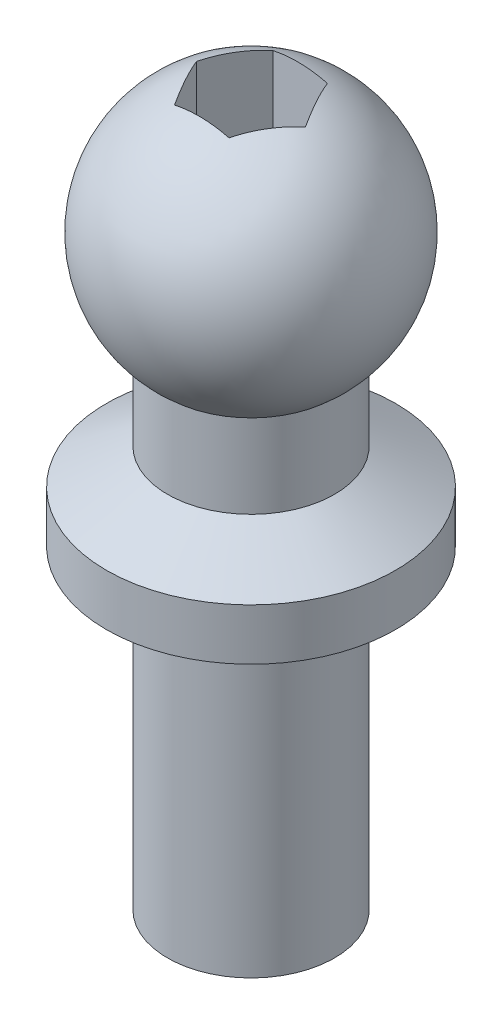
ISO-10303-21;
HEADER;
FILE_DESCRIPTION(('STEP AP214'),'2;1');
FILE_NAME('part.step','',(''),(''),'','','');
FILE_SCHEMA(('AUTOMOTIVE_DESIGN { 1 0 10303 214 1 1 1 1 }'));
ENDSEC;
DATA;
#1=APPLICATION_CONTEXT('core data for automotive mechanical design processes');
#2=APPLICATION_PROTOCOL_DEFINITION('international standard','automotive_design',2000,#1);
#3=PRODUCT_CONTEXT('',#1,'mechanical');
#4=PRODUCT('Part','Part','',(#3));
#5=PRODUCT_RELATED_PRODUCT_CATEGORY('part','',(#4));
#6=PRODUCT_DEFINITION_FORMATION('','',#4);
#7=PRODUCT_DEFINITION_CONTEXT('part definition',#1,'design');
#8=PRODUCT_DEFINITION('design','',#6,#7);
#9=PRODUCT_DEFINITION_SHAPE('','',#8);
#10=(LENGTH_UNIT() NAMED_UNIT(*) SI_UNIT(.MILLI.,.METRE.));
#11=(NAMED_UNIT(*) PLANE_ANGLE_UNIT() SI_UNIT($,.RADIAN.));
#12=(NAMED_UNIT(*) SI_UNIT($,.STERADIAN.) SOLID_ANGLE_UNIT());
#13=UNCERTAINTY_MEASURE_WITH_UNIT(LENGTH_MEASURE(1.E-05),#10,'distance_accuracy_value','');
#14=(GEOMETRIC_REPRESENTATION_CONTEXT(3) GLOBAL_UNCERTAINTY_ASSIGNED_CONTEXT((#13)) GLOBAL_UNIT_ASSIGNED_CONTEXT((#10,
#11,#12)) REPRESENTATION_CONTEXT('',''));
#15=CARTESIAN_POINT('',(0.,0.,0.));
#16=DIRECTION('',(0.,0.,1.));
#17=DIRECTION('',(1.,0.,0.));
#18=AXIS2_PLACEMENT_3D('',#15,#16,#17);
#19=CARTESIAN_POINT('',(0.,9.13356950414487,0.));
#20=DIRECTION('',(0.,-1.,0.));
#21=DIRECTION('',(1.,0.,0.));
#22=AXIS2_PLACEMENT_3D('',#19,#20,#21);
#23=SPHERICAL_SURFACE('',#22,2.05);
#24=CARTESIAN_POINT('',(0.,7.54848275573014,0.));
#25=DIRECTION('',(0.,-1.,0.));
#26=DIRECTION('',(0.,0.,-1.));
#27=AXIS2_PLACEMENT_3D('',#24,#25,#26);
#28=CIRCLE('',#27,1.3);
#29=CARTESIAN_POINT('',(0.,7.54848275573014,-1.3));
#30=VERTEX_POINT('',#29);
#31=EDGE_CURVE('E105',#30,#30,#28,.T.);
#32=ORIENTED_EDGE('',*,*,#31,.F.);
#33=EDGE_LOOP('',(#32));
#34=FACE_BOUND('',#33,.T.);
#35=CARTESIAN_POINT('',(0.657646875245924,9.13356950414487,-0.360555942232646));
#36=DIRECTION('',(-0.876862500327899,0.,0.480741256310195));
#37=DIRECTION('',(0.480741256310195,0.,0.8768625003279));
#38=AXIS2_PLACEMENT_3D('',#35,#36,#37);
#39=CIRCLE('',#38,1.90787840283389);
#40=CARTESIAN_POINT('',(0.449479804939987,10.9916599217511,-0.740248542687597));
#41=VERTEX_POINT('',#40);
#42=CARTESIAN_POINT('',(0.865813945551862,10.9916599217511,0.0191366582223045));
#43=VERTEX_POINT('',#42);
#44=EDGE_CURVE('E129',#41,#43,#39,.F.);
#45=ORIENTED_EDGE('',*,*,#44,.T.);
#46=CARTESIAN_POINT('',(0.641074043081869,9.13356950414487,0.389260929566103));
#47=DIRECTION('',(-0.854765390775825,0.,-0.519014572754804));
#48=DIRECTION('',(-0.519014572754804,0.,0.854765390775825));
#49=AXIS2_PLACEMENT_3D('',#46,#47,#48);
#50=CIRCLE('',#49,1.90787840283389);
#51=CARTESIAN_POINT('',(0.416334140611875,10.9916599217511,0.759385200909902));
#52=VERTEX_POINT('',#51);
#53=EDGE_CURVE('E12',#43,#52,#50,.F.);
#54=ORIENTED_EDGE('',*,*,#53,.T.);
#55=CARTESIAN_POINT('',(-0.0165728321640562,9.13356950414487,0.74981687179875));
#56=DIRECTION('',(0.0220971095520749,0.,-0.999755829064999));
#57=DIRECTION('',(-0.999755829064999,0.,-0.0220971095520749));
#58=AXIS2_PLACEMENT_3D('',#55,#56,#57);
#59=CIRCLE('',#58,1.90787840283389);
#60=CARTESIAN_POINT('',(-0.449479804939987,10.9916599217511,0.740248542687597));
#61=VERTEX_POINT('',#60);
#62=EDGE_CURVE('E45',#52,#61,#59,.F.);
#63=ORIENTED_EDGE('',*,*,#62,.T.);
#64=CARTESIAN_POINT('',(-0.657646875245925,9.13356950414487,0.360555942232646));
#65=DIRECTION('',(0.876862500327899,0.,-0.480741256310195));
#66=DIRECTION('',(-0.480741256310195,0.,-0.876862500327899));
#67=AXIS2_PLACEMENT_3D('',#64,#65,#66);
#68=CIRCLE('',#67,1.90787840283389);
#69=CARTESIAN_POINT('',(-0.865813945551862,10.9916599217511,-0.0191366582223042));
#70=VERTEX_POINT('',#69);
#71=EDGE_CURVE('E138',#61,#70,#68,.F.);
#72=ORIENTED_EDGE('',*,*,#71,.T.);
#73=CARTESIAN_POINT('',(-0.641074043081869,9.13356950414487,-0.389260929566103));
#74=DIRECTION('',(0.854765390775825,0.,0.519014572754804));
#75=DIRECTION('',(0.519014572754804,0.,-0.854765390775825));
#76=AXIS2_PLACEMENT_3D('',#73,#74,#75);
#77=CIRCLE('',#76,1.90787840283389);
#78=CARTESIAN_POINT('',(-0.416334140611875,10.9916599217511,-0.759385200909901));
#79=VERTEX_POINT('',#78);
#80=EDGE_CURVE('E135',#70,#79,#77,.F.);
#81=ORIENTED_EDGE('',*,*,#80,.T.);
#82=CARTESIAN_POINT('',(0.0165728321640558,9.13356950414487,-0.749816871798749));
#83=DIRECTION('',(-0.0220971095520744,0.,0.999755829064999));
#84=DIRECTION('',(0.999755829064999,0.,0.0220971095520744));
#85=AXIS2_PLACEMENT_3D('',#82,#83,#84);
#86=CIRCLE('',#85,1.90787840283389);
#87=EDGE_CURVE('E132',#79,#41,#86,.F.);
#88=ORIENTED_EDGE('',*,*,#87,.T.);
#89=EDGE_LOOP('',(#45,#54,#63,#72,#81,#88));
#90=FACE_BOUND('',#89,.T.);
#91=ADVANCED_FACE('F37',(#34,#90),#23,.T.);
#92=CARTESIAN_POINT('',(0.,0.,0.));
#93=DIRECTION('',(0.,-1.,0.));
#94=DIRECTION('',(0.,0.,-1.));
#95=AXIS2_PLACEMENT_3D('',#92,#93,#94);
#96=PLANE('',#95);
#97=CARTESIAN_POINT('',(0.,0.,0.));
#98=DIRECTION('',(0.,-1.,0.));
#99=DIRECTION('',(0.,0.,-1.));
#100=AXIS2_PLACEMENT_3D('',#97,#98,#99);
#101=CIRCLE('',#100,1.3);
#102=CARTESIAN_POINT('',(0.,0.,-1.3));
#103=VERTEX_POINT('',#102);
#104=EDGE_CURVE('E126',#103,#103,#101,.T.);
#105=ORIENTED_EDGE('',*,*,#104,.T.);
#106=EDGE_LOOP('',(#105));
#107=FACE_BOUND('',#106,.T.);
#108=ADVANCED_FACE('F39',(#107),#96,.T.);
#109=CARTESIAN_POINT('',(0.,0.,0.));
#110=DIRECTION('',(0.,-1.,0.));
#111=DIRECTION('',(0.,0.,-1.));
#112=AXIS2_PLACEMENT_3D('',#109,#110,#111);
#113=CYLINDRICAL_SURFACE('',#112,1.3);
#114=CARTESIAN_POINT('',(0.,4.9,0.));
#115=DIRECTION('',(0.,-1.,0.));
#116=DIRECTION('',(0.,0.,-1.));
#117=AXIS2_PLACEMENT_3D('',#114,#115,#116);
#118=CIRCLE('',#117,1.3);
#119=CARTESIAN_POINT('',(0.,4.9,-1.3));
#120=VERTEX_POINT('',#119);
#121=EDGE_CURVE('E123',#120,#120,#118,.T.);
#122=ORIENTED_EDGE('',*,*,#121,.T.);
#123=EDGE_LOOP('',(#122));
#124=FACE_BOUND('',#123,.T.);
#125=ORIENTED_EDGE('',*,*,#104,.F.);
#126=EDGE_LOOP('',(#125));
#127=FACE_BOUND('',#126,.T.);
#128=ADVANCED_FACE('F181',(#124,#127),#113,.T.);
#129=CARTESIAN_POINT('',(1.3,4.9,0.));
#130=DIRECTION('',(0.,-1.,0.));
#131=DIRECTION('',(0.,0.,-1.));
#132=AXIS2_PLACEMENT_3D('',#129,#130,#131);
#133=PLANE('',#132);
#134=CARTESIAN_POINT('',(0.,4.9,0.));
#135=DIRECTION('',(0.,-1.,0.));
#136=DIRECTION('',(0.,0.,-1.));
#137=AXIS2_PLACEMENT_3D('',#134,#135,#136);
#138=CIRCLE('',#137,2.25);
#139=CARTESIAN_POINT('',(0.,4.9,-2.25));
#140=VERTEX_POINT('',#139);
#141=EDGE_CURVE('E120',#140,#140,#138,.T.);
#142=ORIENTED_EDGE('',*,*,#141,.T.);
#143=EDGE_LOOP('',(#142));
#144=FACE_BOUND('',#143,.T.);
#145=ORIENTED_EDGE('',*,*,#121,.F.);
#146=EDGE_LOOP('',(#145));
#147=FACE_BOUND('',#146,.T.);
#148=ADVANCED_FACE('F198',(#144,#147),#133,.T.);
#149=CARTESIAN_POINT('',(0.,0.,0.));
#150=DIRECTION('',(0.,-1.,0.));
#151=DIRECTION('',(0.,0.,-1.));
#152=AXIS2_PLACEMENT_3D('',#149,#150,#151);
#153=CYLINDRICAL_SURFACE('',#152,2.25);
#154=CARTESIAN_POINT('',(0.,5.7,0.));
#155=DIRECTION('',(0.,-1.,0.));
#156=DIRECTION('',(0.,0.,-1.));
#157=AXIS2_PLACEMENT_3D('',#154,#155,#156);
#158=CIRCLE('',#157,2.25);
#159=CARTESIAN_POINT('',(0.,5.7,-2.25));
#160=VERTEX_POINT('',#159);
#161=EDGE_CURVE('E117',#160,#160,#158,.T.);
#162=ORIENTED_EDGE('',*,*,#161,.T.);
#163=EDGE_LOOP('',(#162));
#164=FACE_BOUND('',#163,.T.);
#165=ORIENTED_EDGE('',*,*,#141,.F.);
#166=EDGE_LOOP('',(#165));
#167=FACE_BOUND('',#166,.T.);
#168=ADVANCED_FACE('F194',(#164,#167),#153,.T.);
#169=CARTESIAN_POINT('',(0.,5.7,0.));
#170=DIRECTION('',(0.,-1.,0.));
#171=DIRECTION('',(0.,0.,-1.));
#172=AXIS2_PLACEMENT_3D('',#169,#170,#171);
#173=CONICAL_SURFACE('',#172,2.25,1.0471975511966);
#174=CARTESIAN_POINT('',(0.,6.24848275573014,0.));
#175=DIRECTION('',(0.,-1.,0.));
#176=DIRECTION('',(0.,0.,-1.));
#177=AXIS2_PLACEMENT_3D('',#174,#175,#176);
#178=CIRCLE('',#177,1.3);
#179=CARTESIAN_POINT('',(0.,6.24848275573014,-1.3));
#180=VERTEX_POINT('',#179);
#181=EDGE_CURVE('E109',#180,#180,#178,.T.);
#182=ORIENTED_EDGE('',*,*,#181,.T.);
#183=EDGE_LOOP('',(#182));
#184=FACE_BOUND('',#183,.T.);
#185=ORIENTED_EDGE('',*,*,#161,.F.);
#186=EDGE_LOOP('',(#185));
#187=FACE_BOUND('',#186,.T.);
#188=ADVANCED_FACE('F190',(#184,#187),#173,.T.);
#189=CARTESIAN_POINT('',(0.,0.,0.));
#190=DIRECTION('',(0.,-1.,0.));
#191=DIRECTION('',(0.,0.,-1.));
#192=AXIS2_PLACEMENT_3D('',#189,#190,#191);
#193=CYLINDRICAL_SURFACE('',#192,1.3);
#194=ORIENTED_EDGE('',*,*,#31,.T.);
#195=EDGE_LOOP('',(#194));
#196=FACE_BOUND('',#195,.T.);
#197=ORIENTED_EDGE('',*,*,#181,.F.);
#198=EDGE_LOOP('',(#197));
#199=FACE_BOUND('',#198,.T.);
#200=ADVANCED_FACE('F187',(#196,#199),#193,.T.);
#201=CARTESIAN_POINT('',(0.865813945551862,9.59,0.0191366582223046));
#202=DIRECTION('',(-0.854765390775825,0.,-0.519014572754804));
#203=DIRECTION('',(-0.519014572754804,0.,0.854765390775825));
#204=AXIS2_PLACEMENT_3D('',#201,#202,#203);
#205=PLANE('',#204);
#206=DIRECTION('',(0.,1.,0.));
#207=VECTOR('',#206,1.);
#208=CARTESIAN_POINT('',(0.865813945551862,9.59,0.0191366582223046));
#209=LINE('',#208,#207);
#210=CARTESIAN_POINT('',(0.865813945551862,9.59,0.0191366582223046));
#211=VERTEX_POINT('',#210);
#212=EDGE_CURVE('E52',#211,#43,#209,.T.);
#213=ORIENTED_EDGE('',*,*,#212,.F.);
#214=DIRECTION('',(-0.519014572754804,0.,0.854765390775825));
#215=VECTOR('',#214,1.);
#216=CARTESIAN_POINT('',(0.865813945551862,9.59,0.0191366582223046));
#217=LINE('',#216,#215);
#218=CARTESIAN_POINT('',(0.416334140611875,9.59,0.759385200909902));
#219=VERTEX_POINT('',#218);
#220=EDGE_CURVE('E95',#211,#219,#217,.T.);
#221=ORIENTED_EDGE('',*,*,#220,.T.);
#222=DIRECTION('',(0.,1.,0.));
#223=VECTOR('',#222,1.);
#224=CARTESIAN_POINT('',(0.416334140611875,9.59,0.759385200909902));
#225=LINE('',#224,#223);
#226=EDGE_CURVE('E102',#219,#52,#225,.T.);
#227=ORIENTED_EDGE('',*,*,#226,.T.);
#228=ORIENTED_EDGE('',*,*,#53,.F.);
#229=EDGE_LOOP('',(#213,#221,#227,#228));
#230=FACE_BOUND('',#229,.T.);
#231=ADVANCED_FACE('F101',(#230),#205,.T.);
#232=CARTESIAN_POINT('',(0.416334140611875,9.59,0.759385200909902));
#233=DIRECTION('',(0.0220971095520749,0.,-0.999755829064999));
#234=DIRECTION('',(-0.999755829064999,0.,-0.0220971095520749));
#235=AXIS2_PLACEMENT_3D('',#232,#233,#234);
#236=PLANE('',#235);
#237=ORIENTED_EDGE('',*,*,#226,.F.);
#238=DIRECTION('',(-0.999755829064999,0.,-0.0220971095520749));
#239=VECTOR('',#238,1.);
#240=CARTESIAN_POINT('',(0.416334140611875,9.59,0.759385200909902));
#241=LINE('',#240,#239);
#242=CARTESIAN_POINT('',(-0.449479804939987,9.59,0.740248542687597));
#243=VERTEX_POINT('',#242);
#244=EDGE_CURVE('E91',#219,#243,#241,.T.);
#245=ORIENTED_EDGE('',*,*,#244,.T.);
#246=DIRECTION('',(0.,1.,0.));
#247=VECTOR('',#246,1.);
#248=CARTESIAN_POINT('',(-0.449479804939987,9.59,0.740248542687597));
#249=LINE('',#248,#247);
#250=EDGE_CURVE('E106',#243,#61,#249,.T.);
#251=ORIENTED_EDGE('',*,*,#250,.T.);
#252=ORIENTED_EDGE('',*,*,#62,.F.);
#253=EDGE_LOOP('',(#237,#245,#251,#252));
#254=FACE_BOUND('',#253,.T.);
#255=ADVANCED_FACE('F104',(#254),#236,.T.);
#256=CARTESIAN_POINT('',(-0.449479804939987,9.59,0.740248542687597));
#257=DIRECTION('',(0.876862500327899,0.,-0.480741256310195));
#258=DIRECTION('',(-0.480741256310195,0.,-0.876862500327899));
#259=AXIS2_PLACEMENT_3D('',#256,#257,#258);
#260=PLANE('',#259);
#261=ORIENTED_EDGE('',*,*,#250,.F.);
#262=DIRECTION('',(-0.480741256310195,0.,-0.876862500327899));
#263=VECTOR('',#262,1.);
#264=CARTESIAN_POINT('',(-0.449479804939987,9.59,0.740248542687597));
#265=LINE('',#264,#263);
#266=CARTESIAN_POINT('',(-0.865813945551862,9.59,-0.0191366582223043));
#267=VERTEX_POINT('',#266);
#268=EDGE_CURVE('E97',#243,#267,#265,.T.);
#269=ORIENTED_EDGE('',*,*,#268,.T.);
#270=DIRECTION('',(0.,1.,0.));
#271=VECTOR('',#270,1.);
#272=CARTESIAN_POINT('',(-0.865813945551862,9.59,-0.0191366582223043));
#273=LINE('',#272,#271);
#274=EDGE_CURVE('E111',#267,#70,#273,.T.);
#275=ORIENTED_EDGE('',*,*,#274,.T.);
#276=ORIENTED_EDGE('',*,*,#71,.F.);
#277=EDGE_LOOP('',(#261,#269,#275,#276));
#278=FACE_BOUND('',#277,.T.);
#279=ADVANCED_FACE('F160',(#278),#260,.T.);
#280=CARTESIAN_POINT('',(-0.865813945551862,9.59,-0.0191366582223043));
#281=DIRECTION('',(0.854765390775825,0.,0.519014572754804));
#282=DIRECTION('',(0.519014572754804,0.,-0.854765390775825));
#283=AXIS2_PLACEMENT_3D('',#280,#281,#282);
#284=PLANE('',#283);
#285=ORIENTED_EDGE('',*,*,#274,.F.);
#286=DIRECTION('',(0.519014572754804,0.,-0.854765390775825));
#287=VECTOR('',#286,1.);
#288=CARTESIAN_POINT('',(-0.865813945551862,9.59,-0.0191366582223043));
#289=LINE('',#288,#287);
#290=CARTESIAN_POINT('',(-0.416334140611875,9.59,-0.759385200909901));
#291=VERTEX_POINT('',#290);
#292=EDGE_CURVE('E163',#267,#291,#289,.T.);
#293=ORIENTED_EDGE('',*,*,#292,.T.);
#294=DIRECTION('',(0.,1.,0.));
#295=VECTOR('',#294,1.);
#296=CARTESIAN_POINT('',(-0.416334140611875,9.59,-0.759385200909901));
#297=LINE('',#296,#295);
#298=EDGE_CURVE('E151',#291,#79,#297,.T.);
#299=ORIENTED_EDGE('',*,*,#298,.T.);
#300=ORIENTED_EDGE('',*,*,#80,.F.);
#301=EDGE_LOOP('',(#285,#293,#299,#300));
#302=FACE_BOUND('',#301,.T.);
#303=ADVANCED_FACE('F162',(#302),#284,.T.);
#304=CARTESIAN_POINT('',(-0.416334140611875,9.59,-0.759385200909901));
#305=DIRECTION('',(-0.0220971095520744,0.,0.999755829064999));
#306=DIRECTION('',(0.999755829064999,0.,0.0220971095520744));
#307=AXIS2_PLACEMENT_3D('',#304,#305,#306);
#308=PLANE('',#307);
#309=ORIENTED_EDGE('',*,*,#298,.F.);
#310=DIRECTION('',(0.999755829064999,0.,0.0220971095520744));
#311=VECTOR('',#310,1.);
#312=CARTESIAN_POINT('',(-0.416334140611875,9.59,-0.759385200909901));
#313=LINE('',#312,#311);
#314=CARTESIAN_POINT('',(0.449479804939987,9.59,-0.740248542687597));
#315=VERTEX_POINT('',#314);
#316=EDGE_CURVE('E150',#291,#315,#313,.T.);
#317=ORIENTED_EDGE('',*,*,#316,.T.);
#318=DIRECTION('',(0.,1.,0.));
#319=VECTOR('',#318,1.);
#320=CARTESIAN_POINT('',(0.449479804939987,9.59,-0.740248542687597));
#321=LINE('',#320,#319);
#322=EDGE_CURVE('E144',#315,#41,#321,.T.);
#323=ORIENTED_EDGE('',*,*,#322,.T.);
#324=ORIENTED_EDGE('',*,*,#87,.F.);
#325=EDGE_LOOP('',(#309,#317,#323,#324));
#326=FACE_BOUND('',#325,.T.);
#327=ADVANCED_FACE('F147',(#326),#308,.T.);
#328=CARTESIAN_POINT('',(0.449479804939987,9.59,-0.740248542687597));
#329=DIRECTION('',(-0.876862500327899,0.,0.480741256310195));
#330=DIRECTION('',(0.480741256310195,0.,0.8768625003279));
#331=AXIS2_PLACEMENT_3D('',#328,#329,#330);
#332=PLANE('',#331);
#333=ORIENTED_EDGE('',*,*,#322,.F.);
#334=DIRECTION('',(0.480741256310195,0.,0.876862500327899));
#335=VECTOR('',#334,1.);
#336=CARTESIAN_POINT('',(0.449479804939987,9.59,-0.740248542687597));
#337=LINE('',#336,#335);
#338=EDGE_CURVE('E154',#315,#211,#337,.T.);
#339=ORIENTED_EDGE('',*,*,#338,.T.);
#340=ORIENTED_EDGE('',*,*,#212,.T.);
#341=ORIENTED_EDGE('',*,*,#44,.F.);
#342=EDGE_LOOP('',(#333,#339,#340,#341));
#343=FACE_BOUND('',#342,.T.);
#344=ADVANCED_FACE('F143',(#343),#332,.T.);
#345=CARTESIAN_POINT('',(0.,9.59,0.));
#346=DIRECTION('',(0.,-1.,0.));
#347=DIRECTION('',(0.,0.,-1.));
#348=AXIS2_PLACEMENT_3D('',#345,#346,#347);
#349=PLANE('',#348);
#350=ORIENTED_EDGE('',*,*,#220,.F.);
#351=ORIENTED_EDGE('',*,*,#338,.F.);
#352=ORIENTED_EDGE('',*,*,#316,.F.);
#353=ORIENTED_EDGE('',*,*,#292,.F.);
#354=ORIENTED_EDGE('',*,*,#268,.F.);
#355=ORIENTED_EDGE('',*,*,#244,.F.);
#356=EDGE_LOOP('',(#350,#351,#352,#353,#354,#355));
#357=FACE_BOUND('',#356,.T.);
#358=ADVANCED_FACE('F93',(#357),#349,.F.);
#359=CLOSED_SHELL('',(#91,#108,#128,#148,#168,#188,#200,#231,#255,#279,#303,#327,#344,#358));
#360=MANIFOLD_SOLID_BREP('B2',#359);
#361=ADVANCED_BREP_SHAPE_REPRESENTATION('',(#18,#360),#14);
#362=SHAPE_DEFINITION_REPRESENTATION(#9,#361);
ENDSEC;
END-ISO-10303-21;
